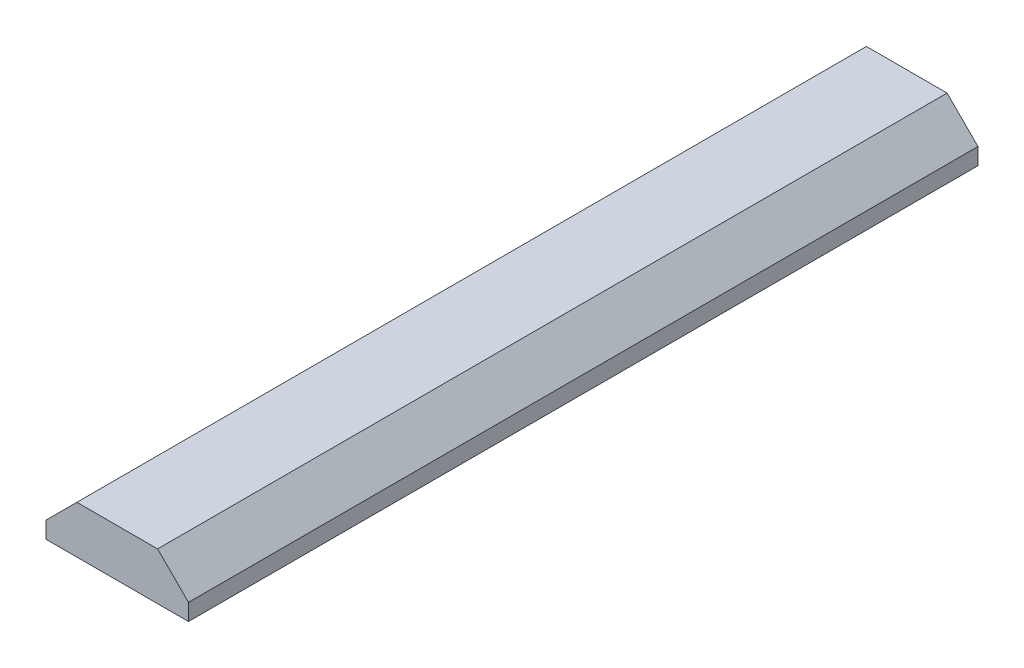
ISO-10303-21;
HEADER;
FILE_DESCRIPTION(('STEP AP214'),'2;1');
FILE_NAME('part.step','',(''),(''),'','','');
FILE_SCHEMA(('AUTOMOTIVE_DESIGN { 1 0 10303 214 1 1 1 1 }'));
ENDSEC;
DATA;
#1=APPLICATION_CONTEXT('core data for automotive mechanical design processes');
#2=APPLICATION_PROTOCOL_DEFINITION('international standard','automotive_design',2000,#1);
#3=PRODUCT_CONTEXT('',#1,'mechanical');
#4=PRODUCT('Part','Part','',(#3));
#5=PRODUCT_RELATED_PRODUCT_CATEGORY('part','',(#4));
#6=PRODUCT_DEFINITION_FORMATION('','',#4);
#7=PRODUCT_DEFINITION_CONTEXT('part definition',#1,'design');
#8=PRODUCT_DEFINITION('design','',#6,#7);
#9=PRODUCT_DEFINITION_SHAPE('','',#8);
#10=(LENGTH_UNIT() NAMED_UNIT(*) SI_UNIT(.MILLI.,.METRE.));
#11=(NAMED_UNIT(*) PLANE_ANGLE_UNIT() SI_UNIT($,.RADIAN.));
#12=(NAMED_UNIT(*) SI_UNIT($,.STERADIAN.) SOLID_ANGLE_UNIT());
#13=UNCERTAINTY_MEASURE_WITH_UNIT(LENGTH_MEASURE(1.E-05),#10,'distance_accuracy_value','');
#14=(GEOMETRIC_REPRESENTATION_CONTEXT(3) GLOBAL_UNCERTAINTY_ASSIGNED_CONTEXT((#13)) GLOBAL_UNIT_ASSIGNED_CONTEXT((#10,
#11,#12)) REPRESENTATION_CONTEXT('',''));
#15=CARTESIAN_POINT('',(0.,0.,0.));
#16=DIRECTION('',(0.,0.,1.));
#17=DIRECTION('',(1.,0.,0.));
#18=AXIS2_PLACEMENT_3D('',#15,#16,#17);
#19=CARTESIAN_POINT('',(3.4,1.80885878693797,66.5));
#20=DIRECTION('',(0.707106781186549,0.707106781186546,0.));
#21=DIRECTION('',(-0.707106781186546,0.707106781186549,0.));
#22=AXIS2_PLACEMENT_3D('',#19,#20,#21);
#23=PLANE('',#22);
#24=DIRECTION('',(0.707106781186546,-0.707106781186549,0.));
#25=VECTOR('',#24,1.);
#26=CARTESIAN_POINT('',(3.4,1.80885878693797,0.));
#27=LINE('',#26,#25);
#28=CARTESIAN_POINT('',(3.4,1.80885878693797,0.));
#29=VERTEX_POINT('',#28);
#30=CARTESIAN_POINT('',(6.,-0.791141213062042,0.));
#31=VERTEX_POINT('',#30);
#32=EDGE_CURVE('E139',#29,#31,#27,.T.);
#33=ORIENTED_EDGE('',*,*,#32,.F.);
#34=DIRECTION('',(0.,0.,-1.));
#35=VECTOR('',#34,1.);
#36=CARTESIAN_POINT('',(3.4,1.80885878693797,66.5));
#37=LINE('',#36,#35);
#38=CARTESIAN_POINT('',(3.4,1.80885878693797,66.5));
#39=VERTEX_POINT('',#38);
#40=EDGE_CURVE('E11',#39,#29,#37,.T.);
#41=ORIENTED_EDGE('',*,*,#40,.F.);
#42=DIRECTION('',(0.707106781186546,-0.707106781186549,0.));
#43=VECTOR('',#42,1.);
#44=CARTESIAN_POINT('',(3.4,1.80885878693797,66.5));
#45=LINE('',#44,#43);
#46=CARTESIAN_POINT('',(6.,-0.791141213062042,66.5));
#47=VERTEX_POINT('',#46);
#48=EDGE_CURVE('E157',#39,#47,#45,.T.);
#49=ORIENTED_EDGE('',*,*,#48,.T.);
#50=DIRECTION('',(0.,0.,-1.));
#51=VECTOR('',#50,1.);
#52=CARTESIAN_POINT('',(6.,-0.791141213062042,66.5));
#53=LINE('',#52,#51);
#54=EDGE_CURVE('E50',#47,#31,#53,.T.);
#55=ORIENTED_EDGE('',*,*,#54,.T.);
#56=EDGE_LOOP('',(#33,#41,#49,#55));
#57=FACE_BOUND('',#56,.T.);
#58=ADVANCED_FACE('F47',(#57),#23,.T.);
#59=CARTESIAN_POINT('',(3.4,1.80885878693797,66.5));
#60=DIRECTION('',(0.,-1.,0.));
#61=DIRECTION('',(0.,0.,-1.));
#62=AXIS2_PLACEMENT_3D('',#59,#60,#61);
#63=PLANE('',#62);
#64=DIRECTION('',(-1.,0.,0.));
#65=VECTOR('',#64,1.);
#66=CARTESIAN_POINT('',(3.4,1.80885878693797,0.));
#67=LINE('',#66,#65);
#68=CARTESIAN_POINT('',(-3.4,1.80885878693797,0.));
#69=VERTEX_POINT('',#68);
#70=EDGE_CURVE('E87',#29,#69,#67,.T.);
#71=ORIENTED_EDGE('',*,*,#70,.T.);
#72=DIRECTION('',(0.,0.,-1.));
#73=VECTOR('',#72,1.);
#74=CARTESIAN_POINT('',(-3.4,1.80885878693797,66.5));
#75=LINE('',#74,#73);
#76=CARTESIAN_POINT('',(-3.4,1.80885878693797,66.5));
#77=VERTEX_POINT('',#76);
#78=EDGE_CURVE('E57',#77,#69,#75,.T.);
#79=ORIENTED_EDGE('',*,*,#78,.F.);
#80=DIRECTION('',(-1.,0.,0.));
#81=VECTOR('',#80,1.);
#82=CARTESIAN_POINT('',(3.4,1.80885878693797,66.5));
#83=LINE('',#82,#81);
#84=EDGE_CURVE('E112',#39,#77,#83,.T.);
#85=ORIENTED_EDGE('',*,*,#84,.F.);
#86=ORIENTED_EDGE('',*,*,#40,.T.);
#87=EDGE_LOOP('',(#71,#79,#85,#86));
#88=FACE_BOUND('',#87,.T.);
#89=ADVANCED_FACE('F183',(#88),#63,.F.);
#90=CARTESIAN_POINT('',(-3.4,1.80885878693797,66.5));
#91=DIRECTION('',(0.707106781186549,-0.707106781186546,0.));
#92=DIRECTION('',(0.707106781186546,0.707106781186549,0.));
#93=AXIS2_PLACEMENT_3D('',#90,#91,#92);
#94=PLANE('',#93);
#95=DIRECTION('',(-0.707106781186546,-0.707106781186549,0.));
#96=VECTOR('',#95,1.);
#97=CARTESIAN_POINT('',(-3.4,1.80885878693797,0.));
#98=LINE('',#97,#96);
#99=CARTESIAN_POINT('',(-6.,-0.791141213062042,0.));
#100=VERTEX_POINT('',#99);
#101=EDGE_CURVE('E120',#69,#100,#98,.T.);
#102=ORIENTED_EDGE('',*,*,#101,.T.);
#103=DIRECTION('',(0.,0.,-1.));
#104=VECTOR('',#103,1.);
#105=CARTESIAN_POINT('',(-6.,-0.791141213062042,66.5));
#106=LINE('',#105,#104);
#107=CARTESIAN_POINT('',(-6.,-0.791141213062042,66.5));
#108=VERTEX_POINT('',#107);
#109=EDGE_CURVE('E117',#108,#100,#106,.T.);
#110=ORIENTED_EDGE('',*,*,#109,.F.);
#111=DIRECTION('',(-0.707106781186546,-0.707106781186549,0.));
#112=VECTOR('',#111,1.);
#113=CARTESIAN_POINT('',(-3.4,1.80885878693797,66.5));
#114=LINE('',#113,#112);
#115=EDGE_CURVE('E105',#77,#108,#114,.T.);
#116=ORIENTED_EDGE('',*,*,#115,.F.);
#117=ORIENTED_EDGE('',*,*,#78,.T.);
#118=EDGE_LOOP('',(#102,#110,#116,#117));
#119=FACE_BOUND('',#118,.T.);
#120=ADVANCED_FACE('F118',(#119),#94,.F.);
#121=CARTESIAN_POINT('',(-6.,-0.791141213062042,66.5));
#122=DIRECTION('',(1.,0.,0.));
#123=DIRECTION('',(0.,0.,-1.));
#124=AXIS2_PLACEMENT_3D('',#121,#122,#123);
#125=PLANE('',#124);
#126=DIRECTION('',(0.,-1.,0.));
#127=VECTOR('',#126,1.);
#128=CARTESIAN_POINT('',(-6.,-0.791141213062042,0.));
#129=LINE('',#128,#127);
#130=CARTESIAN_POINT('',(-6.,-2.19114121306203,0.));
#131=VERTEX_POINT('',#130);
#132=EDGE_CURVE('E151',#100,#131,#129,.T.);
#133=ORIENTED_EDGE('',*,*,#132,.T.);
#134=DIRECTION('',(0.,0.,-1.));
#135=VECTOR('',#134,1.);
#136=CARTESIAN_POINT('',(-6.,-2.19114121306203,66.5));
#137=LINE('',#136,#135);
#138=CARTESIAN_POINT('',(-6.,-2.19114121306203,66.5));
#139=VERTEX_POINT('',#138);
#140=EDGE_CURVE('E124',#139,#131,#137,.T.);
#141=ORIENTED_EDGE('',*,*,#140,.F.);
#142=DIRECTION('',(0.,-1.,0.));
#143=VECTOR('',#142,1.);
#144=CARTESIAN_POINT('',(-6.,-0.791141213062042,66.5));
#145=LINE('',#144,#143);
#146=EDGE_CURVE('E110',#108,#139,#145,.T.);
#147=ORIENTED_EDGE('',*,*,#146,.F.);
#148=ORIENTED_EDGE('',*,*,#109,.T.);
#149=EDGE_LOOP('',(#133,#141,#147,#148));
#150=FACE_BOUND('',#149,.T.);
#151=ADVANCED_FACE('F126',(#150),#125,.F.);
#152=CARTESIAN_POINT('',(-6.,-2.19114121306203,66.5));
#153=DIRECTION('',(0.,1.,0.));
#154=DIRECTION('',(0.,0.,1.));
#155=AXIS2_PLACEMENT_3D('',#152,#153,#154);
#156=PLANE('',#155);
#157=DIRECTION('',(1.,0.,0.));
#158=VECTOR('',#157,1.);
#159=CARTESIAN_POINT('',(-6.,-2.19114121306203,0.));
#160=LINE('',#159,#158);
#161=CARTESIAN_POINT('',(6.,-2.19114121306203,0.));
#162=VERTEX_POINT('',#161);
#163=EDGE_CURVE('E147',#131,#162,#160,.T.);
#164=ORIENTED_EDGE('',*,*,#163,.T.);
#165=DIRECTION('',(0.,0.,-1.));
#166=VECTOR('',#165,1.);
#167=CARTESIAN_POINT('',(6.,-2.19114121306203,66.5));
#168=LINE('',#167,#166);
#169=CARTESIAN_POINT('',(6.,-2.19114121306203,66.5));
#170=VERTEX_POINT('',#169);
#171=EDGE_CURVE('E162',#170,#162,#168,.T.);
#172=ORIENTED_EDGE('',*,*,#171,.F.);
#173=DIRECTION('',(1.,0.,0.));
#174=VECTOR('',#173,1.);
#175=CARTESIAN_POINT('',(-6.,-2.19114121306203,66.5));
#176=LINE('',#175,#174);
#177=EDGE_CURVE('E130',#139,#170,#176,.T.);
#178=ORIENTED_EDGE('',*,*,#177,.F.);
#179=ORIENTED_EDGE('',*,*,#140,.T.);
#180=EDGE_LOOP('',(#164,#172,#178,#179));
#181=FACE_BOUND('',#180,.T.);
#182=ADVANCED_FACE('F171',(#181),#156,.F.);
#183=CARTESIAN_POINT('',(6.,-0.791141213062042,66.5));
#184=DIRECTION('',(1.,0.,0.));
#185=DIRECTION('',(0.,0.,-1.));
#186=AXIS2_PLACEMENT_3D('',#183,#184,#185);
#187=PLANE('',#186);
#188=DIRECTION('',(0.,-1.,0.));
#189=VECTOR('',#188,1.);
#190=CARTESIAN_POINT('',(6.,-0.791141213062042,0.));
#191=LINE('',#190,#189);
#192=EDGE_CURVE('E143',#31,#162,#191,.T.);
#193=ORIENTED_EDGE('',*,*,#192,.F.);
#194=ORIENTED_EDGE('',*,*,#54,.F.);
#195=DIRECTION('',(0.,-1.,0.));
#196=VECTOR('',#195,1.);
#197=CARTESIAN_POINT('',(6.,-0.791141213062042,66.5));
#198=LINE('',#197,#196);
#199=EDGE_CURVE('E133',#47,#170,#198,.T.);
#200=ORIENTED_EDGE('',*,*,#199,.T.);
#201=ORIENTED_EDGE('',*,*,#171,.T.);
#202=EDGE_LOOP('',(#193,#194,#200,#201));
#203=FACE_BOUND('',#202,.T.);
#204=ADVANCED_FACE('F166',(#203),#187,.T.);
#205=CARTESIAN_POINT('',(0.,0.,66.5));
#206=DIRECTION('',(0.,0.,-1.));
#207=DIRECTION('',(-1.,0.,0.));
#208=AXIS2_PLACEMENT_3D('',#205,#206,#207);
#209=PLANE('',#208);
#210=ORIENTED_EDGE('',*,*,#48,.F.);
#211=ORIENTED_EDGE('',*,*,#84,.T.);
#212=ORIENTED_EDGE('',*,*,#115,.T.);
#213=ORIENTED_EDGE('',*,*,#146,.T.);
#214=ORIENTED_EDGE('',*,*,#177,.T.);
#215=ORIENTED_EDGE('',*,*,#199,.F.);
#216=EDGE_LOOP('',(#210,#211,#212,#213,#214,#215));
#217=FACE_BOUND('',#216,.T.);
#218=ADVANCED_FACE('F108',(#217),#209,.F.);
#219=CARTESIAN_POINT('',(0.,0.,0.));
#220=DIRECTION('',(0.,0.,-1.));
#221=DIRECTION('',(-1.,0.,0.));
#222=AXIS2_PLACEMENT_3D('',#219,#220,#221);
#223=PLANE('',#222);
#224=ORIENTED_EDGE('',*,*,#32,.T.);
#225=ORIENTED_EDGE('',*,*,#192,.T.);
#226=ORIENTED_EDGE('',*,*,#163,.F.);
#227=ORIENTED_EDGE('',*,*,#132,.F.);
#228=ORIENTED_EDGE('',*,*,#101,.F.);
#229=ORIENTED_EDGE('',*,*,#70,.F.);
#230=EDGE_LOOP('',(#224,#225,#226,#227,#228,#229));
#231=FACE_BOUND('',#230,.T.);
#232=ADVANCED_FACE('F169',(#231),#223,.T.);
#233=CLOSED_SHELL('',(#58,#89,#120,#151,#182,#204,#218,#232));
#234=MANIFOLD_SOLID_BREP('B2',#233);
#235=ADVANCED_BREP_SHAPE_REPRESENTATION('',(#18,#234),#14);
#236=SHAPE_DEFINITION_REPRESENTATION(#9,#235);
ENDSEC;
END-ISO-10303-21;
